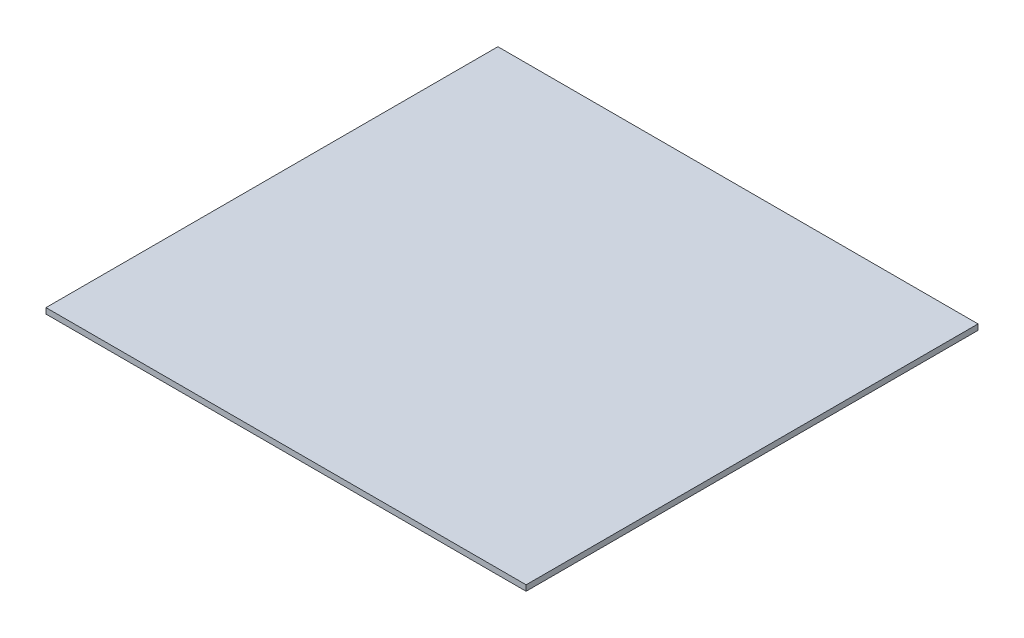
ISO-10303-21;
HEADER;
FILE_DESCRIPTION(('STEP AP214'),'2;1');
FILE_NAME('part.step','',(''),(''),'','','');
FILE_SCHEMA(('AUTOMOTIVE_DESIGN { 1 0 10303 214 1 1 1 1 }'));
ENDSEC;
DATA;
#1=APPLICATION_CONTEXT('core data for automotive mechanical design processes');
#2=APPLICATION_PROTOCOL_DEFINITION('international standard','automotive_design',2000,#1);
#3=PRODUCT_CONTEXT('',#1,'mechanical');
#4=PRODUCT('Part','Part','',(#3));
#5=PRODUCT_RELATED_PRODUCT_CATEGORY('part','',(#4));
#6=PRODUCT_DEFINITION_FORMATION('','',#4);
#7=PRODUCT_DEFINITION_CONTEXT('part definition',#1,'design');
#8=PRODUCT_DEFINITION('design','',#6,#7);
#9=PRODUCT_DEFINITION_SHAPE('','',#8);
#10=(LENGTH_UNIT() NAMED_UNIT(*) SI_UNIT(.MILLI.,.METRE.));
#11=(NAMED_UNIT(*) PLANE_ANGLE_UNIT() SI_UNIT($,.RADIAN.));
#12=(NAMED_UNIT(*) SI_UNIT($,.STERADIAN.) SOLID_ANGLE_UNIT());
#13=UNCERTAINTY_MEASURE_WITH_UNIT(LENGTH_MEASURE(1.E-05),#10,'distance_accuracy_value','');
#14=(GEOMETRIC_REPRESENTATION_CONTEXT(3) GLOBAL_UNCERTAINTY_ASSIGNED_CONTEXT((#13)) GLOBAL_UNIT_ASSIGNED_CONTEXT((#10,
#11,#12)) REPRESENTATION_CONTEXT('',''));
#15=CARTESIAN_POINT('',(0.,0.,0.));
#16=DIRECTION('',(0.,0.,1.));
#17=DIRECTION('',(1.,0.,0.));
#18=AXIS2_PLACEMENT_3D('',#15,#16,#17);
#19=CARTESIAN_POINT('',(215.9,5.08,203.2));
#20=DIRECTION('',(-1.,0.,0.));
#21=DIRECTION('',(0.,0.,1.));
#22=AXIS2_PLACEMENT_3D('',#19,#20,#21);
#23=PLANE('',#22);
#24=DIRECTION('',(0.,0.,-1.));
#25=VECTOR('',#24,1.);
#26=CARTESIAN_POINT('',(215.9,0.,203.2));
#27=LINE('',#26,#25);
#28=CARTESIAN_POINT('',(215.9,0.,203.2));
#29=VERTEX_POINT('',#28);
#30=CARTESIAN_POINT('',(215.9,0.,-203.2));
#31=VERTEX_POINT('',#30);
#32=EDGE_CURVE('E96',#29,#31,#27,.T.);
#33=ORIENTED_EDGE('',*,*,#32,.T.);
#34=DIRECTION('',(0.,-1.,0.));
#35=VECTOR('',#34,1.);
#36=CARTESIAN_POINT('',(215.9,5.08,-203.2));
#37=LINE('',#36,#35);
#38=CARTESIAN_POINT('',(215.9,5.08,-203.2));
#39=VERTEX_POINT('',#38);
#40=EDGE_CURVE('E11',#39,#31,#37,.T.);
#41=ORIENTED_EDGE('',*,*,#40,.F.);
#42=DIRECTION('',(0.,0.,-1.));
#43=VECTOR('',#42,1.);
#44=CARTESIAN_POINT('',(215.9,5.08,203.2));
#45=LINE('',#44,#43);
#46=CARTESIAN_POINT('',(215.9,5.08,203.2));
#47=VERTEX_POINT('',#46);
#48=EDGE_CURVE('E84',#47,#39,#45,.T.);
#49=ORIENTED_EDGE('',*,*,#48,.F.);
#50=DIRECTION('',(0.,-1.,0.));
#51=VECTOR('',#50,1.);
#52=CARTESIAN_POINT('',(215.9,5.08,203.2));
#53=LINE('',#52,#51);
#54=EDGE_CURVE('E92',#47,#29,#53,.T.);
#55=ORIENTED_EDGE('',*,*,#54,.T.);
#56=EDGE_LOOP('',(#33,#41,#49,#55));
#57=FACE_BOUND('',#56,.T.);
#58=ADVANCED_FACE('F33',(#57),#23,.F.);
#59=CARTESIAN_POINT('',(-215.9,5.08,-203.2));
#60=DIRECTION('',(0.,0.,1.));
#61=DIRECTION('',(1.,0.,0.));
#62=AXIS2_PLACEMENT_3D('',#59,#60,#61);
#63=PLANE('',#62);
#64=DIRECTION('',(-1.,0.,0.));
#65=VECTOR('',#64,1.);
#66=CARTESIAN_POINT('',(-215.9,0.,-203.2));
#67=LINE('',#66,#65);
#68=CARTESIAN_POINT('',(-215.9,0.,-203.2));
#69=VERTEX_POINT('',#68);
#70=EDGE_CURVE('E88',#31,#69,#67,.T.);
#71=ORIENTED_EDGE('',*,*,#70,.T.);
#72=DIRECTION('',(0.,-1.,0.));
#73=VECTOR('',#72,1.);
#74=CARTESIAN_POINT('',(-215.9,5.08,-203.2));
#75=LINE('',#74,#73);
#76=CARTESIAN_POINT('',(-215.9,5.08,-203.2));
#77=VERTEX_POINT('',#76);
#78=EDGE_CURVE('E41',#77,#69,#75,.T.);
#79=ORIENTED_EDGE('',*,*,#78,.F.);
#80=DIRECTION('',(-1.,0.,0.));
#81=VECTOR('',#80,1.);
#82=CARTESIAN_POINT('',(-215.9,5.08,-203.2));
#83=LINE('',#82,#81);
#84=EDGE_CURVE('E79',#39,#77,#83,.T.);
#85=ORIENTED_EDGE('',*,*,#84,.F.);
#86=ORIENTED_EDGE('',*,*,#40,.T.);
#87=EDGE_LOOP('',(#71,#79,#85,#86));
#88=FACE_BOUND('',#87,.T.);
#89=ADVANCED_FACE('F87',(#88),#63,.F.);
#90=CARTESIAN_POINT('',(-215.9,5.08,203.2));
#91=DIRECTION('',(1.,0.,0.));
#92=DIRECTION('',(0.,0.,-1.));
#93=AXIS2_PLACEMENT_3D('',#90,#91,#92);
#94=PLANE('',#93);
#95=DIRECTION('',(0.,0.,1.));
#96=VECTOR('',#95,1.);
#97=CARTESIAN_POINT('',(-215.9,0.,203.2));
#98=LINE('',#97,#96);
#99=CARTESIAN_POINT('',(-215.9,0.,203.2));
#100=VERTEX_POINT('',#99);
#101=EDGE_CURVE('E66',#69,#100,#98,.T.);
#102=ORIENTED_EDGE('',*,*,#101,.T.);
#103=DIRECTION('',(0.,-1.,0.));
#104=VECTOR('',#103,1.);
#105=CARTESIAN_POINT('',(-215.9,5.08,203.2));
#106=LINE('',#105,#104);
#107=CARTESIAN_POINT('',(-215.9,5.08,203.2));
#108=VERTEX_POINT('',#107);
#109=EDGE_CURVE('E89',#108,#100,#106,.T.);
#110=ORIENTED_EDGE('',*,*,#109,.F.);
#111=DIRECTION('',(0.,0.,1.));
#112=VECTOR('',#111,1.);
#113=CARTESIAN_POINT('',(-215.9,5.08,203.2));
#114=LINE('',#113,#112);
#115=EDGE_CURVE('E82',#77,#108,#114,.T.);
#116=ORIENTED_EDGE('',*,*,#115,.F.);
#117=ORIENTED_EDGE('',*,*,#78,.T.);
#118=EDGE_LOOP('',(#102,#110,#116,#117));
#119=FACE_BOUND('',#118,.T.);
#120=ADVANCED_FACE('F90',(#119),#94,.F.);
#121=CARTESIAN_POINT('',(-215.9,5.08,203.2));
#122=DIRECTION('',(0.,0.,-1.));
#123=DIRECTION('',(-1.,0.,0.));
#124=AXIS2_PLACEMENT_3D('',#121,#122,#123);
#125=PLANE('',#124);
#126=DIRECTION('',(1.,0.,0.));
#127=VECTOR('',#126,1.);
#128=CARTESIAN_POINT('',(-215.9,0.,203.2));
#129=LINE('',#128,#127);
#130=EDGE_CURVE('E72',#100,#29,#129,.T.);
#131=ORIENTED_EDGE('',*,*,#130,.T.);
#132=ORIENTED_EDGE('',*,*,#54,.F.);
#133=DIRECTION('',(1.,0.,0.));
#134=VECTOR('',#133,1.);
#135=CARTESIAN_POINT('',(-215.9,5.08,203.2));
#136=LINE('',#135,#134);
#137=EDGE_CURVE('E49',#108,#47,#136,.T.);
#138=ORIENTED_EDGE('',*,*,#137,.F.);
#139=ORIENTED_EDGE('',*,*,#109,.T.);
#140=EDGE_LOOP('',(#131,#132,#138,#139));
#141=FACE_BOUND('',#140,.T.);
#142=ADVANCED_FACE('F103',(#141),#125,.F.);
#143=CARTESIAN_POINT('',(0.,5.08,0.));
#144=DIRECTION('',(0.,-1.,0.));
#145=DIRECTION('',(0.,0.,-1.));
#146=AXIS2_PLACEMENT_3D('',#143,#144,#145);
#147=PLANE('',#146);
#148=ORIENTED_EDGE('',*,*,#48,.T.);
#149=ORIENTED_EDGE('',*,*,#84,.T.);
#150=ORIENTED_EDGE('',*,*,#115,.T.);
#151=ORIENTED_EDGE('',*,*,#137,.T.);
#152=EDGE_LOOP('',(#148,#149,#150,#151));
#153=FACE_BOUND('',#152,.T.);
#154=ADVANCED_FACE('F80',(#153),#147,.F.);
#155=CARTESIAN_POINT('',(0.,0.,0.));
#156=DIRECTION('',(0.,-1.,0.));
#157=DIRECTION('',(0.,0.,-1.));
#158=AXIS2_PLACEMENT_3D('',#155,#156,#157);
#159=PLANE('',#158);
#160=ORIENTED_EDGE('',*,*,#32,.F.);
#161=ORIENTED_EDGE('',*,*,#130,.F.);
#162=ORIENTED_EDGE('',*,*,#101,.F.);
#163=ORIENTED_EDGE('',*,*,#70,.F.);
#164=EDGE_LOOP('',(#160,#161,#162,#163));
#165=FACE_BOUND('',#164,.T.);
#166=ADVANCED_FACE('F106',(#165),#159,.T.);
#167=CLOSED_SHELL('',(#58,#89,#120,#142,#154,#166));
#168=MANIFOLD_SOLID_BREP('B2',#167);
#169=ADVANCED_BREP_SHAPE_REPRESENTATION('',(#18,#168),#14);
#170=SHAPE_DEFINITION_REPRESENTATION(#9,#169);
ENDSEC;
END-ISO-10303-21;
